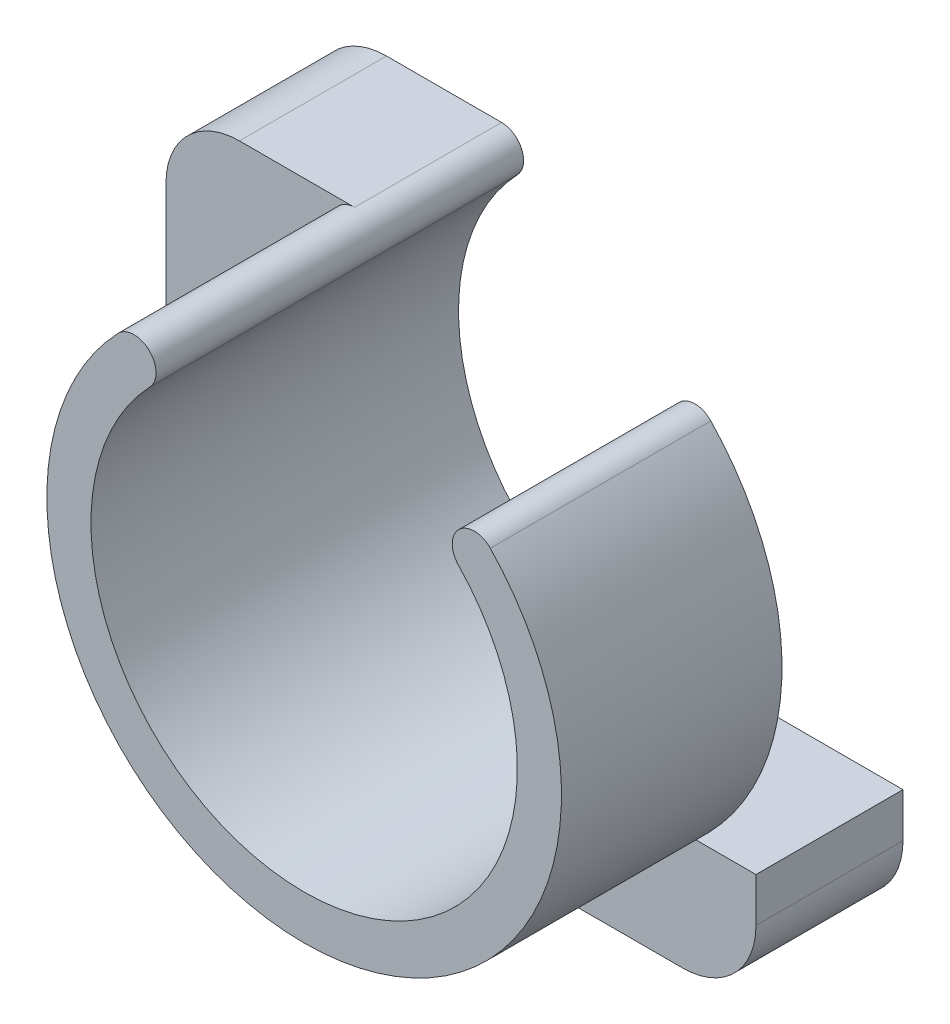
ISO-10303-21;
HEADER;
FILE_DESCRIPTION(('STEP AP214'),'2;1');
FILE_NAME('part.step','',(''),(''),'','','');
FILE_SCHEMA(('AUTOMOTIVE_DESIGN { 1 0 10303 214 1 1 1 1 }'));
ENDSEC;
DATA;
#1=APPLICATION_CONTEXT('core data for automotive mechanical design processes');
#2=APPLICATION_PROTOCOL_DEFINITION('international standard','automotive_design',2000,#1);
#3=PRODUCT_CONTEXT('',#1,'mechanical');
#4=PRODUCT('Part','Part','',(#3));
#5=PRODUCT_RELATED_PRODUCT_CATEGORY('part','',(#4));
#6=PRODUCT_DEFINITION_FORMATION('','',#4);
#7=PRODUCT_DEFINITION_CONTEXT('part definition',#1,'design');
#8=PRODUCT_DEFINITION('design','',#6,#7);
#9=PRODUCT_DEFINITION_SHAPE('','',#8);
#10=(LENGTH_UNIT() NAMED_UNIT(*) SI_UNIT(.MILLI.,.METRE.));
#11=(NAMED_UNIT(*) PLANE_ANGLE_UNIT() SI_UNIT($,.RADIAN.));
#12=(NAMED_UNIT(*) SI_UNIT($,.STERADIAN.) SOLID_ANGLE_UNIT());
#13=UNCERTAINTY_MEASURE_WITH_UNIT(LENGTH_MEASURE(1.E-05),#10,'distance_accuracy_value','');
#14=(GEOMETRIC_REPRESENTATION_CONTEXT(3) GLOBAL_UNCERTAINTY_ASSIGNED_CONTEXT((#13)) GLOBAL_UNIT_ASSIGNED_CONTEXT((#10,
#11,#12)) REPRESENTATION_CONTEXT('',''));
#15=CARTESIAN_POINT('',(0.,0.,0.));
#16=DIRECTION('',(0.,0.,1.));
#17=DIRECTION('',(1.,0.,0.));
#18=AXIS2_PLACEMENT_3D('',#15,#16,#17);
#19=CARTESIAN_POINT('',(0.,0.,10.));
#20=DIRECTION('',(0.,0.,1.));
#21=DIRECTION('',(1.,0.,0.));
#22=AXIS2_PLACEMENT_3D('',#19,#20,#21);
#23=PLANE('',#22);
#24=DIRECTION('',(1.,0.,0.));
#25=VECTOR('',#24,1.);
#26=CARTESIAN_POINT('',(0.,-26.4952543633348,10.));
#27=LINE('',#26,#25);
#28=CARTESIAN_POINT('',(4.21610810716788,-26.4952543633348,10.));
#29=VERTEX_POINT('',#28);
#30=CARTESIAN_POINT('',(9.60344776348812,-26.4952543633348,10.));
#31=VERTEX_POINT('',#30);
#32=EDGE_CURVE('E155',#29,#31,#27,.T.);
#33=ORIENTED_EDGE('',*,*,#32,.F.);
#34=CARTESIAN_POINT('',(-2.00000000000009,-13.3952543633348,10.));
#35=DIRECTION('',(0.,0.,1.));
#36=DIRECTION('',(1.,0.,0.));
#37=AXIS2_PLACEMENT_3D('',#34,#35,#36);
#38=CIRCLE('',#37,14.5);
#39=CARTESIAN_POINT('',(8.48826695752036,-3.38294912289265,10.));
#40=VERTEX_POINT('',#39);
#41=EDGE_CURVE('E184',#29,#40,#38,.T.);
#42=ORIENTED_EDGE('',*,*,#41,.T.);
#43=CARTESIAN_POINT('',(9.57326009105695,-2.34719340836416,10.));
#44=DIRECTION('',(0.,0.,1.));
#45=DIRECTION('',(1.,0.,0.));
#46=AXIS2_PLACEMENT_3D('',#43,#44,#45);
#47=CIRCLE('',#46,1.5);
#48=CARTESIAN_POINT('',(10.6582532245936,-1.31143769383566,10.));
#49=VERTEX_POINT('',#48);
#50=EDGE_CURVE('E176',#49,#40,#47,.T.);
#51=ORIENTED_EDGE('',*,*,#50,.F.);
#52=CARTESIAN_POINT('',(-2.00000000000009,-13.3952543633348,10.));
#53=DIRECTION('',(0.,0.,1.));
#54=DIRECTION('',(1.,0.,0.));
#55=AXIS2_PLACEMENT_3D('',#52,#53,#54);
#56=CIRCLE('',#55,17.5);
#57=EDGE_CURVE('E188',#31,#49,#56,.T.);
#58=ORIENTED_EDGE('',*,*,#57,.F.);
#59=EDGE_LOOP('',(#33,#42,#51,#58));
#60=FACE_BOUND('',#59,.T.);
#61=ADVANCED_FACE('F35',(#60),#23,.F.);
#62=CARTESIAN_POINT('',(-2.00000000000009,-13.3952543633348,25.));
#63=DIRECTION('',(0.,0.,-1.));
#64=DIRECTION('',(-1.,0.,0.));
#65=AXIS2_PLACEMENT_3D('',#62,#63,#64);
#66=CYLINDRICAL_SURFACE('',#65,14.5);
#67=DIRECTION('',(0.,0.,-1.));
#68=VECTOR('',#67,1.);
#69=CARTESIAN_POINT('',(4.21610810716789,-26.4952543633348,62.3694482044339));
#70=LINE('',#69,#68);
#71=CARTESIAN_POINT('',(4.21610810716789,-26.4952543633348,0.));
#72=VERTEX_POINT('',#71);
#73=EDGE_CURVE('E160',#29,#72,#70,.T.);
#74=ORIENTED_EDGE('',*,*,#73,.T.);
#75=CARTESIAN_POINT('',(-2.00000000000009,-13.3952543633348,0.));
#76=DIRECTION('',(0.,0.,1.));
#77=DIRECTION('',(1.,0.,0.));
#78=AXIS2_PLACEMENT_3D('',#75,#76,#77);
#79=CIRCLE('',#78,14.5);
#80=CARTESIAN_POINT('',(-12.4882669575205,-3.38294912289265,0.));
#81=VERTEX_POINT('',#80);
#82=EDGE_CURVE('E234',#81,#72,#79,.T.);
#83=ORIENTED_EDGE('',*,*,#82,.F.);
#84=DIRECTION('',(0.,0.,-1.));
#85=VECTOR('',#84,1.);
#86=CARTESIAN_POINT('',(-12.4882669575205,-3.38294912289265,25.));
#87=LINE('',#86,#85);
#88=CARTESIAN_POINT('',(-12.4882669575205,-3.38294912289265,25.));
#89=VERTEX_POINT('',#88);
#90=EDGE_CURVE('E201',#89,#81,#87,.T.);
#91=ORIENTED_EDGE('',*,*,#90,.F.);
#92=CARTESIAN_POINT('',(-2.00000000000009,-13.3952543633348,25.));
#93=DIRECTION('',(0.,0.,1.));
#94=DIRECTION('',(1.,0.,0.));
#95=AXIS2_PLACEMENT_3D('',#92,#93,#94);
#96=CIRCLE('',#95,14.5);
#97=CARTESIAN_POINT('',(8.48826695752036,-3.38294912289265,25.));
#98=VERTEX_POINT('',#97);
#99=EDGE_CURVE('E172',#89,#98,#96,.T.);
#100=ORIENTED_EDGE('',*,*,#99,.T.);
#101=DIRECTION('',(0.,0.,-1.));
#102=VECTOR('',#101,1.);
#103=CARTESIAN_POINT('',(8.48826695752036,-3.38294912289265,25.));
#104=LINE('',#103,#102);
#105=EDGE_CURVE('E183',#98,#40,#104,.T.);
#106=ORIENTED_EDGE('',*,*,#105,.T.);
#107=ORIENTED_EDGE('',*,*,#41,.F.);
#108=EDGE_LOOP('',(#74,#83,#91,#100,#106,#107));
#109=FACE_BOUND('',#108,.T.);
#110=ADVANCED_FACE('F262',(#109),#66,.F.);
#111=CARTESIAN_POINT('',(-13.5732600910571,-2.34719340836416,25.));
#112=DIRECTION('',(0.,0.,-1.));
#113=DIRECTION('',(-1.,0.,0.));
#114=AXIS2_PLACEMENT_3D('',#111,#112,#113);
#115=CYLINDRICAL_SURFACE('',#114,1.5);
#116=CARTESIAN_POINT('',(-13.5732600910571,-2.34719340836416,10.));
#117=DIRECTION('',(0.,0.,1.));
#118=DIRECTION('',(1.,0.,0.));
#119=AXIS2_PLACEMENT_3D('',#116,#117,#118);
#120=CIRCLE('',#119,1.5);
#121=CARTESIAN_POINT('',(-14.6582532245937,-1.31143769383566,10.));
#122=VERTEX_POINT('',#121);
#123=CARTESIAN_POINT('',(-13.5732600910571,-0.847193408364158,10.));
#124=VERTEX_POINT('',#123);
#125=EDGE_CURVE('E186',#122,#124,#120,.F.);
#126=ORIENTED_EDGE('',*,*,#125,.F.);
#127=DIRECTION('',(0.,0.,-1.));
#128=VECTOR('',#127,1.);
#129=CARTESIAN_POINT('',(-14.6582532245937,-1.31143769383566,25.));
#130=LINE('',#129,#128);
#131=CARTESIAN_POINT('',(-14.6582532245937,-1.31143769383566,25.));
#132=VERTEX_POINT('',#131);
#133=EDGE_CURVE('E199',#132,#122,#130,.T.);
#134=ORIENTED_EDGE('',*,*,#133,.F.);
#135=CARTESIAN_POINT('',(-13.5732600910571,-2.34719340836416,25.));
#136=DIRECTION('',(0.,0.,1.));
#137=DIRECTION('',(1.,0.,0.));
#138=AXIS2_PLACEMENT_3D('',#135,#136,#137);
#139=CIRCLE('',#138,1.5);
#140=EDGE_CURVE('E175',#132,#89,#139,.F.);
#141=ORIENTED_EDGE('',*,*,#140,.T.);
#142=ORIENTED_EDGE('',*,*,#90,.T.);
#143=CARTESIAN_POINT('',(-13.5732600910571,-2.34719340836416,0.));
#144=DIRECTION('',(0.,0.,1.));
#145=DIRECTION('',(1.,0.,0.));
#146=AXIS2_PLACEMENT_3D('',#143,#144,#145);
#147=CIRCLE('',#146,1.5);
#148=CARTESIAN_POINT('',(-13.5732600910571,-0.847193408364159,0.));
#149=VERTEX_POINT('',#148);
#150=EDGE_CURVE('E163',#81,#149,#147,.T.);
#151=ORIENTED_EDGE('',*,*,#150,.T.);
#152=DIRECTION('',(0.,0.,-1.));
#153=VECTOR('',#152,1.);
#154=CARTESIAN_POINT('',(-13.5732600910571,-0.847193408364159,62.3694482044339));
#155=LINE('',#154,#153);
#156=EDGE_CURVE('E169',#124,#149,#155,.T.);
#157=ORIENTED_EDGE('',*,*,#156,.F.);
#158=EDGE_LOOP('',(#126,#134,#141,#142,#151,#157));
#159=FACE_BOUND('',#158,.T.);
#160=ADVANCED_FACE('F268',(#159),#115,.T.);
#161=CARTESIAN_POINT('',(-2.00000000000009,-13.3952543633348,25.));
#162=DIRECTION('',(0.,0.,-1.));
#163=DIRECTION('',(-1.,0.,0.));
#164=AXIS2_PLACEMENT_3D('',#161,#162,#163);
#165=CYLINDRICAL_SURFACE('',#164,17.5);
#166=EDGE_CURVE('E189',#122,#31,#56,.T.);
#167=ORIENTED_EDGE('',*,*,#166,.T.);
#168=ORIENTED_EDGE('',*,*,#57,.T.);
#169=DIRECTION('',(0.,0.,-1.));
#170=VECTOR('',#169,1.);
#171=CARTESIAN_POINT('',(10.6582532245936,-1.31143769383566,25.));
#172=LINE('',#171,#170);
#173=CARTESIAN_POINT('',(10.6582532245936,-1.31143769383566,25.));
#174=VERTEX_POINT('',#173);
#175=EDGE_CURVE('E196',#174,#49,#172,.T.);
#176=ORIENTED_EDGE('',*,*,#175,.F.);
#177=CARTESIAN_POINT('',(-2.00000000000009,-13.3952543633348,25.));
#178=DIRECTION('',(0.,0.,1.));
#179=DIRECTION('',(1.,0.,0.));
#180=AXIS2_PLACEMENT_3D('',#177,#178,#179);
#181=CIRCLE('',#180,17.5);
#182=EDGE_CURVE('E179',#132,#174,#181,.T.);
#183=ORIENTED_EDGE('',*,*,#182,.F.);
#184=ORIENTED_EDGE('',*,*,#133,.T.);
#185=EDGE_LOOP('',(#167,#168,#176,#183,#184));
#186=FACE_BOUND('',#185,.T.);
#187=ADVANCED_FACE('F278',(#186),#165,.T.);
#188=CARTESIAN_POINT('',(9.57326009105695,-2.34719340836416,25.));
#189=DIRECTION('',(0.,0.,-1.));
#190=DIRECTION('',(-1.,0.,0.));
#191=AXIS2_PLACEMENT_3D('',#188,#189,#190);
#192=CYLINDRICAL_SURFACE('',#191,1.5);
#193=ORIENTED_EDGE('',*,*,#50,.T.);
#194=ORIENTED_EDGE('',*,*,#105,.F.);
#195=CARTESIAN_POINT('',(9.57326009105695,-2.34719340836416,25.));
#196=DIRECTION('',(0.,0.,1.));
#197=DIRECTION('',(1.,0.,0.));
#198=AXIS2_PLACEMENT_3D('',#195,#196,#197);
#199=CIRCLE('',#198,1.5);
#200=EDGE_CURVE('E181',#174,#98,#199,.T.);
#201=ORIENTED_EDGE('',*,*,#200,.F.);
#202=ORIENTED_EDGE('',*,*,#175,.T.);
#203=EDGE_LOOP('',(#193,#194,#201,#202));
#204=FACE_BOUND('',#203,.T.);
#205=ADVANCED_FACE('F275',(#204),#192,.T.);
#206=CARTESIAN_POINT('',(0.,0.,25.));
#207=DIRECTION('',(0.,0.,1.));
#208=DIRECTION('',(1.,0.,0.));
#209=AXIS2_PLACEMENT_3D('',#206,#207,#208);
#210=PLANE('',#209);
#211=ORIENTED_EDGE('',*,*,#99,.F.);
#212=ORIENTED_EDGE('',*,*,#140,.F.);
#213=ORIENTED_EDGE('',*,*,#182,.T.);
#214=ORIENTED_EDGE('',*,*,#200,.T.);
#215=EDGE_LOOP('',(#211,#212,#213,#214));
#216=FACE_BOUND('',#215,.T.);
#217=ADVANCED_FACE('F273',(#216),#210,.T.);
#218=CARTESIAN_POINT('',(0.,0.,10.));
#219=DIRECTION('',(0.,0.,1.));
#220=DIRECTION('',(1.,0.,0.));
#221=AXIS2_PLACEMENT_3D('',#218,#219,#220);
#222=PLANE('',#221);
#223=DIRECTION('',(-1.,0.,0.));
#224=VECTOR('',#223,1.);
#225=CARTESIAN_POINT('',(0.,-34.4952543633348,10.));
#226=LINE('',#225,#224);
#227=CARTESIAN_POINT('',(8.72937950189926,-34.4952543633348,10.));
#228=VERTEX_POINT('',#227);
#229=CARTESIAN_POINT('',(-21.4000000000002,-34.4952543633348,10.));
#230=VERTEX_POINT('',#229);
#231=EDGE_CURVE('E242',#228,#230,#226,.T.);
#232=ORIENTED_EDGE('',*,*,#231,.F.);
#233=CARTESIAN_POINT('',(8.72937950189926,-29.4952543633348,10.));
#234=DIRECTION('',(0.,0.,1.));
#235=DIRECTION('',(1.,0.,0.));
#236=AXIS2_PLACEMENT_3D('',#233,#234,#235);
#237=CIRCLE('',#236,5.);
#238=CARTESIAN_POINT('',(13.7293795018993,-29.4952543633348,10.));
#239=VERTEX_POINT('',#238);
#240=EDGE_CURVE('E140',#228,#239,#237,.T.);
#241=ORIENTED_EDGE('',*,*,#240,.T.);
#242=DIRECTION('',(0.,1.,0.));
#243=VECTOR('',#242,1.);
#244=CARTESIAN_POINT('',(13.7293795018993,0.,10.));
#245=LINE('',#244,#243);
#246=CARTESIAN_POINT('',(13.7293795018993,-26.4952543633348,10.));
#247=VERTEX_POINT('',#246);
#248=EDGE_CURVE('E132',#239,#247,#245,.T.);
#249=ORIENTED_EDGE('',*,*,#248,.T.);
#250=EDGE_CURVE('E137',#31,#247,#27,.T.);
#251=ORIENTED_EDGE('',*,*,#250,.F.);
#252=ORIENTED_EDGE('',*,*,#166,.F.);
#253=ORIENTED_EDGE('',*,*,#125,.T.);
#254=DIRECTION('',(-1.,0.,0.));
#255=VECTOR('',#254,1.);
#256=CARTESIAN_POINT('',(0.,-0.847193408364157,10.));
#257=LINE('',#256,#255);
#258=CARTESIAN_POINT('',(-21.4000000000002,-0.847193408364159,10.));
#259=VERTEX_POINT('',#258);
#260=EDGE_CURVE('E145',#124,#259,#257,.T.);
#261=ORIENTED_EDGE('',*,*,#260,.T.);
#262=CARTESIAN_POINT('',(-21.4000000000002,-5.84719340836416,10.));
#263=DIRECTION('',(0.,0.,1.));
#264=DIRECTION('',(1.,0.,0.));
#265=AXIS2_PLACEMENT_3D('',#262,#263,#264);
#266=CIRCLE('',#265,5.);
#267=CARTESIAN_POINT('',(-26.4000000000002,-5.84719340836416,10.));
#268=VERTEX_POINT('',#267);
#269=EDGE_CURVE('E56',#259,#268,#266,.T.);
#270=ORIENTED_EDGE('',*,*,#269,.T.);
#271=DIRECTION('',(0.,-1.,0.));
#272=VECTOR('',#271,1.);
#273=CARTESIAN_POINT('',(-26.4000000000002,0.,10.));
#274=LINE('',#273,#272);
#275=CARTESIAN_POINT('',(-26.4000000000002,-29.4952543633348,10.));
#276=VERTEX_POINT('',#275);
#277=EDGE_CURVE('E166',#268,#276,#274,.T.);
#278=ORIENTED_EDGE('',*,*,#277,.T.);
#279=CARTESIAN_POINT('',(-21.4000000000002,-29.4952543633348,10.));
#280=DIRECTION('',(0.,0.,1.));
#281=DIRECTION('',(1.,0.,0.));
#282=AXIS2_PLACEMENT_3D('',#279,#280,#281);
#283=CIRCLE('',#282,5.);
#284=EDGE_CURVE('E217',#276,#230,#283,.T.);
#285=ORIENTED_EDGE('',*,*,#284,.T.);
#286=EDGE_LOOP('',(#232,#241,#249,#251,#252,#253,#261,#270,#278,#285));
#287=FACE_BOUND('',#286,.T.);
#288=ADVANCED_FACE('F135',(#287),#222,.T.);
#289=CARTESIAN_POINT('',(0.,-34.4952543633348,62.3694482044339));
#290=DIRECTION('',(0.,-1.,0.));
#291=DIRECTION('',(1.,0.,0.));
#292=AXIS2_PLACEMENT_3D('',#289,#290,#291);
#293=PLANE('',#292);
#294=DIRECTION('',(-1.,0.,0.));
#295=VECTOR('',#294,1.);
#296=CARTESIAN_POINT('',(0.,-34.4952543633348,0.));
#297=LINE('',#296,#295);
#298=CARTESIAN_POINT('',(8.72937950189926,-34.4952543633348,0.));
#299=VERTEX_POINT('',#298);
#300=CARTESIAN_POINT('',(-21.4000000000002,-34.4952543633348,0.));
#301=VERTEX_POINT('',#300);
#302=EDGE_CURVE('E232',#299,#301,#297,.T.);
#303=ORIENTED_EDGE('',*,*,#302,.F.);
#304=DIRECTION('',(0.,0.,-1.));
#305=VECTOR('',#304,1.);
#306=CARTESIAN_POINT('',(8.72937950189926,-34.4952543633348,10.));
#307=LINE('',#306,#305);
#308=EDGE_CURVE('E214',#299,#228,#307,.F.);
#309=ORIENTED_EDGE('',*,*,#308,.T.);
#310=ORIENTED_EDGE('',*,*,#231,.T.);
#311=DIRECTION('',(0.,0.,-1.));
#312=VECTOR('',#311,1.);
#313=CARTESIAN_POINT('',(-21.4000000000002,-34.4952543633348,0.));
#314=LINE('',#313,#312);
#315=EDGE_CURVE('E211',#230,#301,#314,.T.);
#316=ORIENTED_EDGE('',*,*,#315,.T.);
#317=EDGE_LOOP('',(#303,#309,#310,#316));
#318=FACE_BOUND('',#317,.T.);
#319=ADVANCED_FACE('F248',(#318),#293,.T.);
#320=CARTESIAN_POINT('',(13.7293795018993,0.,62.3694482044339));
#321=DIRECTION('',(-1.,0.,0.));
#322=DIRECTION('',(0.,0.,1.));
#323=AXIS2_PLACEMENT_3D('',#320,#321,#322);
#324=PLANE('',#323);
#325=ORIENTED_EDGE('',*,*,#248,.F.);
#326=DIRECTION('',(0.,0.,-1.));
#327=VECTOR('',#326,1.);
#328=CARTESIAN_POINT('',(13.7293795018993,-29.4952543633348,0.));
#329=LINE('',#328,#327);
#330=CARTESIAN_POINT('',(13.7293795018993,-29.4952543633348,0.));
#331=VERTEX_POINT('',#330);
#332=EDGE_CURVE('E203',#239,#331,#329,.T.);
#333=ORIENTED_EDGE('',*,*,#332,.T.);
#334=DIRECTION('',(0.,1.,0.));
#335=VECTOR('',#334,1.);
#336=CARTESIAN_POINT('',(13.7293795018993,0.,0.));
#337=LINE('',#336,#335);
#338=CARTESIAN_POINT('',(13.7293795018993,-26.4952543633348,0.));
#339=VERTEX_POINT('',#338);
#340=EDGE_CURVE('E156',#331,#339,#337,.T.);
#341=ORIENTED_EDGE('',*,*,#340,.T.);
#342=DIRECTION('',(0.,0.,-1.));
#343=VECTOR('',#342,1.);
#344=CARTESIAN_POINT('',(13.7293795018993,-26.4952543633348,62.3694482044339));
#345=LINE('',#344,#343);
#346=EDGE_CURVE('E153',#247,#339,#345,.T.);
#347=ORIENTED_EDGE('',*,*,#346,.F.);
#348=EDGE_LOOP('',(#325,#333,#341,#347));
#349=FACE_BOUND('',#348,.T.);
#350=ADVANCED_FACE('F158',(#349),#324,.F.);
#351=CARTESIAN_POINT('',(0.,-26.4952543633348,62.3694482044339));
#352=DIRECTION('',(0.,1.,0.));
#353=DIRECTION('',(0.,0.,1.));
#354=AXIS2_PLACEMENT_3D('',#351,#352,#353);
#355=PLANE('',#354);
#356=ORIENTED_EDGE('',*,*,#73,.F.);
#357=ORIENTED_EDGE('',*,*,#32,.T.);
#358=ORIENTED_EDGE('',*,*,#250,.T.);
#359=ORIENTED_EDGE('',*,*,#346,.T.);
#360=DIRECTION('',(1.,0.,0.));
#361=VECTOR('',#360,1.);
#362=CARTESIAN_POINT('',(0.,-26.4952543633348,0.));
#363=LINE('',#362,#361);
#364=EDGE_CURVE('E146',#72,#339,#363,.T.);
#365=ORIENTED_EDGE('',*,*,#364,.F.);
#366=EDGE_LOOP('',(#356,#357,#358,#359,#365));
#367=FACE_BOUND('',#366,.T.);
#368=ADVANCED_FACE('F151',(#367),#355,.T.);
#369=CARTESIAN_POINT('',(0.,-0.847193408364157,62.3694482044339));
#370=DIRECTION('',(0.,-1.,0.));
#371=DIRECTION('',(1.,0.,0.));
#372=AXIS2_PLACEMENT_3D('',#369,#370,#371);
#373=PLANE('',#372);
#374=DIRECTION('',(-1.,0.,0.));
#375=VECTOR('',#374,1.);
#376=CARTESIAN_POINT('',(0.,-0.847193408364157,0.));
#377=LINE('',#376,#375);
#378=CARTESIAN_POINT('',(-21.4000000000002,-0.847193408364159,0.));
#379=VERTEX_POINT('',#378);
#380=EDGE_CURVE('E171',#149,#379,#377,.T.);
#381=ORIENTED_EDGE('',*,*,#380,.T.);
#382=DIRECTION('',(0.,0.,-1.));
#383=VECTOR('',#382,1.);
#384=CARTESIAN_POINT('',(-21.4000000000002,-0.847193408364159,62.3694482044339));
#385=LINE('',#384,#383);
#386=EDGE_CURVE('E11',#379,#259,#385,.F.);
#387=ORIENTED_EDGE('',*,*,#386,.T.);
#388=ORIENTED_EDGE('',*,*,#260,.F.);
#389=ORIENTED_EDGE('',*,*,#156,.T.);
#390=EDGE_LOOP('',(#381,#387,#388,#389));
#391=FACE_BOUND('',#390,.T.);
#392=ADVANCED_FACE('F303',(#391),#373,.F.);
#393=CARTESIAN_POINT('',(-26.4000000000002,0.,62.3694482044339));
#394=DIRECTION('',(1.,0.,0.));
#395=DIRECTION('',(0.,1.,0.));
#396=AXIS2_PLACEMENT_3D('',#393,#394,#395);
#397=PLANE('',#396);
#398=DIRECTION('',(0.,-1.,0.));
#399=VECTOR('',#398,1.);
#400=CARTESIAN_POINT('',(-26.4000000000002,0.,0.));
#401=LINE('',#400,#399);
#402=CARTESIAN_POINT('',(-26.4000000000002,-5.84719340836416,0.));
#403=VERTEX_POINT('',#402);
#404=CARTESIAN_POINT('',(-26.4000000000002,-29.4952543633348,0.));
#405=VERTEX_POINT('',#404);
#406=EDGE_CURVE('E225',#403,#405,#401,.T.);
#407=ORIENTED_EDGE('',*,*,#406,.T.);
#408=DIRECTION('',(0.,0.,-1.));
#409=VECTOR('',#408,1.);
#410=CARTESIAN_POINT('',(-26.4000000000002,-29.4952543633348,10.));
#411=LINE('',#410,#409);
#412=EDGE_CURVE('E43',#405,#276,#411,.F.);
#413=ORIENTED_EDGE('',*,*,#412,.T.);
#414=ORIENTED_EDGE('',*,*,#277,.F.);
#415=DIRECTION('',(0.,0.,-1.));
#416=VECTOR('',#415,1.);
#417=CARTESIAN_POINT('',(-26.4000000000002,-5.84719340836416,62.3694482044339));
#418=LINE('',#417,#416);
#419=EDGE_CURVE('E220',#268,#403,#418,.T.);
#420=ORIENTED_EDGE('',*,*,#419,.T.);
#421=EDGE_LOOP('',(#407,#413,#414,#420));
#422=FACE_BOUND('',#421,.T.);
#423=ADVANCED_FACE('F224',(#422),#397,.F.);
#424=CARTESIAN_POINT('',(0.,0.,0.));
#425=DIRECTION('',(0.,0.,1.));
#426=DIRECTION('',(1.,0.,0.));
#427=AXIS2_PLACEMENT_3D('',#424,#425,#426);
#428=PLANE('',#427);
#429=ORIENTED_EDGE('',*,*,#340,.F.);
#430=CARTESIAN_POINT('',(8.72937950189926,-29.4952543633348,0.));
#431=DIRECTION('',(0.,0.,1.));
#432=DIRECTION('',(1.,0.,0.));
#433=AXIS2_PLACEMENT_3D('',#430,#431,#432);
#434=CIRCLE('',#433,5.);
#435=EDGE_CURVE('E209',#331,#299,#434,.F.);
#436=ORIENTED_EDGE('',*,*,#435,.T.);
#437=ORIENTED_EDGE('',*,*,#302,.T.);
#438=CARTESIAN_POINT('',(-21.4000000000002,-29.4952543633348,0.));
#439=DIRECTION('',(0.,0.,1.));
#440=DIRECTION('',(1.,0.,0.));
#441=AXIS2_PLACEMENT_3D('',#438,#439,#440);
#442=CIRCLE('',#441,5.);
#443=EDGE_CURVE('E207',#301,#405,#442,.F.);
#444=ORIENTED_EDGE('',*,*,#443,.T.);
#445=ORIENTED_EDGE('',*,*,#406,.F.);
#446=CARTESIAN_POINT('',(-21.4000000000002,-5.84719340836416,0.));
#447=DIRECTION('',(0.,0.,1.));
#448=DIRECTION('',(1.,0.,0.));
#449=AXIS2_PLACEMENT_3D('',#446,#447,#448);
#450=CIRCLE('',#449,5.);
#451=EDGE_CURVE('E205',#403,#379,#450,.F.);
#452=ORIENTED_EDGE('',*,*,#451,.T.);
#453=ORIENTED_EDGE('',*,*,#380,.F.);
#454=ORIENTED_EDGE('',*,*,#150,.F.);
#455=ORIENTED_EDGE('',*,*,#82,.T.);
#456=ORIENTED_EDGE('',*,*,#364,.T.);
#457=EDGE_LOOP('',(#429,#436,#437,#444,#445,#452,#453,#454,#455,#456));
#458=FACE_BOUND('',#457,.T.);
#459=ADVANCED_FACE('F228',(#458),#428,.F.);
#460=CARTESIAN_POINT('',(8.72937950189926,-29.4952543633348,62.3694482044339));
#461=DIRECTION('',(0.,0.,1.));
#462=DIRECTION('',(1.,0.,0.));
#463=AXIS2_PLACEMENT_3D('',#460,#461,#462);
#464=CYLINDRICAL_SURFACE('',#463,5.);
#465=ORIENTED_EDGE('',*,*,#240,.F.);
#466=ORIENTED_EDGE('',*,*,#308,.F.);
#467=ORIENTED_EDGE('',*,*,#435,.F.);
#468=ORIENTED_EDGE('',*,*,#332,.F.);
#469=EDGE_LOOP('',(#465,#466,#467,#468));
#470=FACE_BOUND('',#469,.T.);
#471=ADVANCED_FACE('F254',(#470),#464,.T.);
#472=CARTESIAN_POINT('',(-21.4000000000002,-29.4952543633348,62.3694482044339));
#473=DIRECTION('',(0.,0.,1.));
#474=DIRECTION('',(1.,0.,0.));
#475=AXIS2_PLACEMENT_3D('',#472,#473,#474);
#476=CYLINDRICAL_SURFACE('',#475,5.);
#477=ORIENTED_EDGE('',*,*,#284,.F.);
#478=ORIENTED_EDGE('',*,*,#412,.F.);
#479=ORIENTED_EDGE('',*,*,#443,.F.);
#480=ORIENTED_EDGE('',*,*,#315,.F.);
#481=EDGE_LOOP('',(#477,#478,#479,#480));
#482=FACE_BOUND('',#481,.T.);
#483=ADVANCED_FACE('F252',(#482),#476,.T.);
#484=CARTESIAN_POINT('',(-21.4000000000002,-5.84719340836416,62.3694482044339));
#485=DIRECTION('',(0.,0.,-1.));
#486=DIRECTION('',(-1.,0.,0.));
#487=AXIS2_PLACEMENT_3D('',#484,#485,#486);
#488=CYLINDRICAL_SURFACE('',#487,5.);
#489=ORIENTED_EDGE('',*,*,#269,.F.);
#490=ORIENTED_EDGE('',*,*,#386,.F.);
#491=ORIENTED_EDGE('',*,*,#451,.F.);
#492=ORIENTED_EDGE('',*,*,#419,.F.);
#493=EDGE_LOOP('',(#489,#490,#491,#492));
#494=FACE_BOUND('',#493,.T.);
#495=ADVANCED_FACE('F37',(#494),#488,.T.);
#496=CLOSED_SHELL('',(#61,#110,#160,#187,#205,#217,#288,#319,#350,#368,#392,#423,#459,#471,#483,#495));
#497=MANIFOLD_SOLID_BREP('B2',#496);
#498=ADVANCED_BREP_SHAPE_REPRESENTATION('',(#18,#497),#14);
#499=SHAPE_DEFINITION_REPRESENTATION(#9,#498);
ENDSEC;
END-ISO-10303-21;
